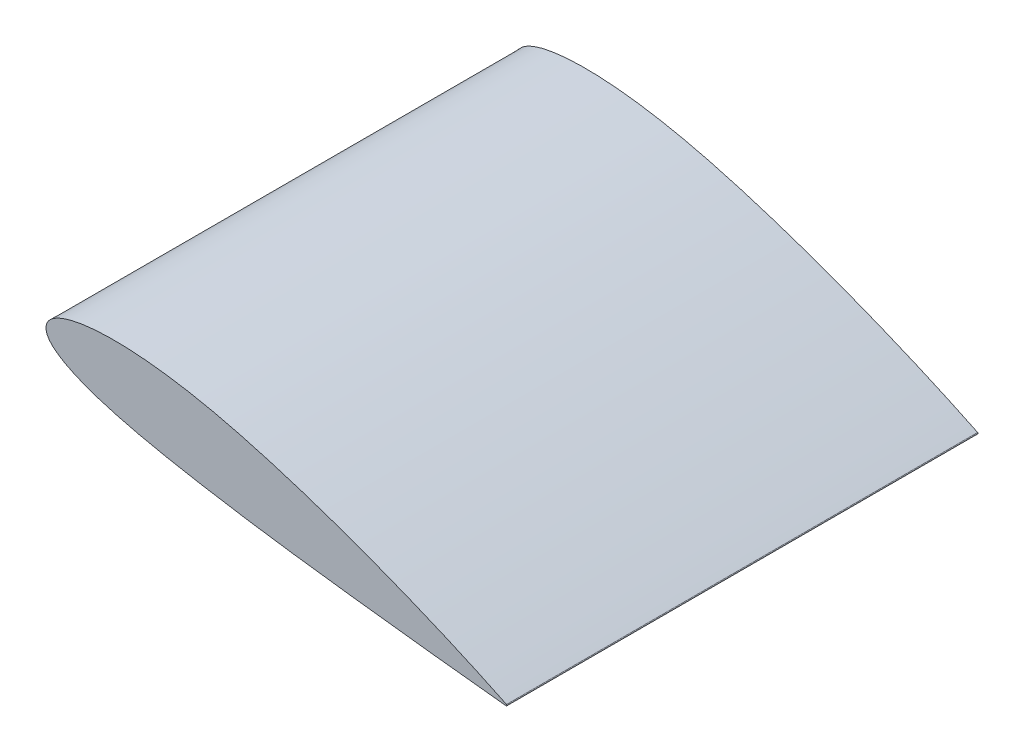
ISO-10303-21;
HEADER;
FILE_DESCRIPTION(('STEP AP214'),'2;1');
FILE_NAME('part.step','',(''),(''),'','','');
FILE_SCHEMA(('AUTOMOTIVE_DESIGN { 1 0 10303 214 1 1 1 1 }'));
ENDSEC;
DATA;
#1=APPLICATION_CONTEXT('core data for automotive mechanical design processes');
#2=APPLICATION_PROTOCOL_DEFINITION('international standard','automotive_design',2000,#1);
#3=PRODUCT_CONTEXT('',#1,'mechanical');
#4=PRODUCT('Part','Part','',(#3));
#5=PRODUCT_RELATED_PRODUCT_CATEGORY('part','',(#4));
#6=PRODUCT_DEFINITION_FORMATION('','',#4);
#7=PRODUCT_DEFINITION_CONTEXT('part definition',#1,'design');
#8=PRODUCT_DEFINITION('design','',#6,#7);
#9=PRODUCT_DEFINITION_SHAPE('','',#8);
#10=(LENGTH_UNIT() NAMED_UNIT(*) SI_UNIT(.MILLI.,.METRE.));
#11=(NAMED_UNIT(*) PLANE_ANGLE_UNIT() SI_UNIT($,.RADIAN.));
#12=(NAMED_UNIT(*) SI_UNIT($,.STERADIAN.) SOLID_ANGLE_UNIT());
#13=UNCERTAINTY_MEASURE_WITH_UNIT(LENGTH_MEASURE(1.E-05),#10,'distance_accuracy_value','');
#14=(GEOMETRIC_REPRESENTATION_CONTEXT(3) GLOBAL_UNCERTAINTY_ASSIGNED_CONTEXT((#13)) GLOBAL_UNIT_ASSIGNED_CONTEXT((#10,
#11,#12)) REPRESENTATION_CONTEXT('',''));
#15=CARTESIAN_POINT('',(0.,0.,0.));
#16=DIRECTION('',(0.,0.,1.));
#17=DIRECTION('',(1.,0.,0.));
#18=AXIS2_PLACEMENT_3D('',#15,#16,#17);
#19=CARTESIAN_POINT('',(93.0586603401604,-19.5766326634734,-127.));
#20=CARTESIAN_POINT('',(92.9570024031191,-19.526335478335,-127.));
#21=CARTESIAN_POINT('',(92.5395177145517,-19.3197770404548,-127.));
#22=CARTESIAN_POINT('',(91.5919136093808,-18.8713818292214,-127.));
#23=CARTESIAN_POINT('',(90.0209402387516,-18.1207589830441,-127.));
#24=CARTESIAN_POINT('',(87.8382147190076,-17.0988282549567,-127.));
#25=CARTESIAN_POINT('',(85.0665212592635,-15.8213172253829,-127.));
#26=CARTESIAN_POINT('',(81.7322626860257,-14.3132753020164,-127.));
#27=CARTESIAN_POINT('',(77.8644434983453,-12.6100497239082,-127.));
#28=CARTESIAN_POINT('',(73.5035744477143,-10.7365973458046,-127.));
#29=CARTESIAN_POINT('',(68.6904902191342,-8.7323656298943,-127.));
#30=CARTESIAN_POINT('',(63.474966761396,-6.62946967938085,-127.));
#31=CARTESIAN_POINT('',(57.9086169512114,-4.46705090747938,-127.));
#32=CARTESIAN_POINT('',(52.0496487733107,-2.28032752176042,-127.));
#33=CARTESIAN_POINT('',(45.958672309095,-0.10834160577163,-127.));
#34=CARTESIAN_POINT('',(39.6995239551761,2.01003839680255,-127.));
#35=CARTESIAN_POINT('',(33.3384873522213,4.03993976814188,-127.));
#36=CARTESIAN_POINT('',(26.9397888183334,5.93853109417681,-127.));
#37=CARTESIAN_POINT('',(20.5560978150045,7.68719028007833,-127.));
#38=CARTESIAN_POINT('',(14.2451613833883,9.21162080589179,-127.));
#39=CARTESIAN_POINT('',(8.07867690324422,10.4721033294232,-127.));
#40=CARTESIAN_POINT('',(2.14793293394034,11.4461848526644,-127.));
#41=CARTESIAN_POINT('',(-3.4745336281449,12.127374153549,-127.));
#42=CARTESIAN_POINT('',(-8.72210533152348,12.5095938303939,-127.));
#43=CARTESIAN_POINT('',(-13.5304552164742,12.6059595477218,-127.));
#44=CARTESIAN_POINT('',(-17.8422714057568,12.4246177821927,-127.));
#45=CARTESIAN_POINT('',(-21.6078266297221,11.9941367342961,-127.));
#46=CARTESIAN_POINT('',(-24.7852303610678,11.3307506011008,-127.));
#47=CARTESIAN_POINT('',(-27.3493844123884,10.464386920837,-127.));
#48=CARTESIAN_POINT('',(-29.2867459316771,9.40768277733117,-127.));
#49=CARTESIAN_POINT('',(-30.6036570328359,8.13744308132767,-127.));
#50=CARTESIAN_POINT('',(-31.1858503182274,6.6153553231,-127.));
#51=CARTESIAN_POINT('',(-30.948197504284,5.00672079909341,-127.));
#52=CARTESIAN_POINT('',(-29.9590692613712,3.47998568367411,-127.));
#53=CARTESIAN_POINT('',(-28.3368318401596,2.01650272638255,-127.));
#54=CARTESIAN_POINT('',(-26.0935344330945,0.578915896711411,-127.));
#55=CARTESIAN_POINT('',(-23.2442369635098,-0.830892785387249,-127.));
#56=CARTESIAN_POINT('',(-19.8146653741149,-2.20500809935629,-127.));
#57=CARTESIAN_POINT('',(-15.8395417475455,-3.53102753603345,-127.));
#58=CARTESIAN_POINT('',(-11.3617472657459,-4.80460998339912,-127.));
#59=CARTESIAN_POINT('',(-6.42884231192341,-6.02123131660751,-127.));
#60=CARTESIAN_POINT('',(-1.09269728776795,-7.18321857985703,-127.));
#61=CARTESIAN_POINT('',(4.59008040315868,-8.2943315095586,-127.));
#62=CARTESIAN_POINT('',(10.5591120777589,-9.36305454101999,-127.));
#63=CARTESIAN_POINT('',(16.7693349758511,-10.4077185848987,-127.));
#64=CARTESIAN_POINT('',(23.1572949137321,-11.4220478713945,-127.));
#65=CARTESIAN_POINT('',(29.6592891793678,-12.3729547218072,-127.));
#66=CARTESIAN_POINT('',(36.1807632889223,-13.2729401488393,-127.));
#67=CARTESIAN_POINT('',(42.6480424700331,-14.1225084538232,-127.));
#68=CARTESIAN_POINT('',(48.9879783827579,-14.9242016598455,-127.));
#69=CARTESIAN_POINT('',(55.1287966389954,-15.6824447140846,-127.));
#70=CARTESIAN_POINT('',(61.0027800848974,-16.3868254401119,-127.));
#71=CARTESIAN_POINT('',(66.5429263914039,-17.0405259184565,-127.));
#72=CARTESIAN_POINT('',(71.6874515144797,-17.6350916778184,-127.));
#73=CARTESIAN_POINT('',(76.3773960646738,-18.1680510062031,-127.));
#74=CARTESIAN_POINT('',(80.558605362021,-18.6365649013372,-127.));
#75=CARTESIAN_POINT('',(84.1837790104455,-19.0335585607668,-127.));
#76=CARTESIAN_POINT('',(87.2103196306277,-19.3591200896401,-127.));
#77=CARTESIAN_POINT('',(89.6028868613607,-19.6128649821528,-127.));
#78=CARTESIAN_POINT('',(91.3320797358895,-19.7955217201453,-127.));
#79=CARTESIAN_POINT('',(92.3826920634706,-19.9031209045822,-127.));
#80=CARTESIAN_POINT('',(92.8541068482899,-19.9532717518215,-127.));
#81=CARTESIAN_POINT('',(92.9758503003284,-19.9662232702342,-127.));
#82=B_SPLINE_CURVE_WITH_KNOTS('',3,(#19,#20,#21,#22,#23,#24,#25,#26,#27,#28,#29,#30,#31,#32,#33,
#34,#35,#36,#37,#38,#39,#40,#41,#42,#43,#44,#45,#46,#47,#48,#49,#50,#51,#52,#53,#54,#55,#56,#57,
#58,#59,#60,#61,#62,#63,#64,#65,#66,#67,#68,#69,#70,#71,#72,#73,#74,#75,#76,#77,#78,#79,#80,
#81),.UNSPECIFIED.,.F.,.F.,(4,1,1,1,1,1,1,1,1,1,1,1,1,1,1,1,1,1,1,1,1,1,1,1,1,1,1,1,1,1,1,1,1,1,
1,1,1,1,1,1,1,1,1,1,1,1,1,1,1,1,1,1,1,1,1,1,1,1,1,1,4),(0.,0.00130334450771463,
0.00535252230899537,0.0120463391317453,0.0213110944502395,0.0330476223945204,0.0471172151209096,
0.0633625080701345,0.0816121152043147,0.101657457251514,0.123273921483703,0.146232520323734,
0.170277757132092,0.195135791457301,0.220540260457298,0.246208390086661,0.271859817624248,
0.297233649675704,0.32226027454309,0.346452957899317,0.369543630541379,0.39130727551813,
0.411513240657824,0.429980366745659,0.446542667033163,0.461070388848797,0.473485741632755,
0.483779538851851,0.492063936444463,0.498681587764252,0.504376592822902,0.510069862803764,
0.516664638096755,0.524877655219018,0.535024568512073,0.547190470696629,0.561360064127826,
0.577448521055754,0.595323849545367,0.61484313654323,0.635823685513443,0.658074561029986,
0.681378870254446,0.705504985620235,0.730440423602308,0.755703478300476,0.78101527468104,
0.806090940754041,0.830659549821916,0.854449960993451,0.877193251088143,0.898643274073507,
0.918555547337279,0.936704445205411,0.952884105716394,0.966904110051011,0.978611737935814,
0.987863880462776,0.994552223257594,0.998593104909067,1.),.UNSPECIFIED.);
#83=DIRECTION('',(0.,0.,1.));
#84=VECTOR('',#83,1.);
#85=SURFACE_OF_LINEAR_EXTRUSION('',#82,#84);
#86=CARTESIAN_POINT('',(93.0586603401604,-19.5766326634734,0.));
#87=CARTESIAN_POINT('',(92.9570024031191,-19.526335478335,0.));
#88=CARTESIAN_POINT('',(92.5395177145517,-19.3197770404548,0.));
#89=CARTESIAN_POINT('',(91.5919136093808,-18.8713818292214,0.));
#90=CARTESIAN_POINT('',(90.0209402387516,-18.1207589830441,0.));
#91=CARTESIAN_POINT('',(87.8382147190076,-17.0988282549567,0.));
#92=CARTESIAN_POINT('',(85.0665212592635,-15.8213172253829,0.));
#93=CARTESIAN_POINT('',(81.7322626860257,-14.3132753020164,0.));
#94=CARTESIAN_POINT('',(77.8644434983453,-12.6100497239082,0.));
#95=CARTESIAN_POINT('',(73.5035744477143,-10.7365973458046,0.));
#96=CARTESIAN_POINT('',(68.6904902191342,-8.7323656298943,0.));
#97=CARTESIAN_POINT('',(63.474966761396,-6.62946967938085,0.));
#98=CARTESIAN_POINT('',(57.9086169512114,-4.46705090747938,0.));
#99=CARTESIAN_POINT('',(52.0496487733107,-2.28032752176042,0.));
#100=CARTESIAN_POINT('',(45.958672309095,-0.10834160577163,0.));
#101=CARTESIAN_POINT('',(39.6995239551761,2.01003839680255,0.));
#102=CARTESIAN_POINT('',(33.3384873522213,4.03993976814188,0.));
#103=CARTESIAN_POINT('',(26.9397888183334,5.93853109417681,0.));
#104=CARTESIAN_POINT('',(20.5560978150045,7.68719028007833,0.));
#105=CARTESIAN_POINT('',(14.2451613833883,9.21162080589179,0.));
#106=CARTESIAN_POINT('',(8.07867690324422,10.4721033294232,0.));
#107=CARTESIAN_POINT('',(2.14793293394034,11.4461848526644,0.));
#108=CARTESIAN_POINT('',(-3.4745336281449,12.127374153549,0.));
#109=CARTESIAN_POINT('',(-8.72210533152348,12.5095938303939,0.));
#110=CARTESIAN_POINT('',(-13.5304552164742,12.6059595477218,0.));
#111=CARTESIAN_POINT('',(-17.8422714057568,12.4246177821927,0.));
#112=CARTESIAN_POINT('',(-21.6078266297221,11.9941367342961,0.));
#113=CARTESIAN_POINT('',(-24.7852303610678,11.3307506011008,0.));
#114=CARTESIAN_POINT('',(-27.3493844123884,10.464386920837,0.));
#115=CARTESIAN_POINT('',(-29.2867459316771,9.40768277733117,0.));
#116=CARTESIAN_POINT('',(-30.6036570328359,8.13744308132767,0.));
#117=CARTESIAN_POINT('',(-31.1858503182274,6.6153553231,0.));
#118=CARTESIAN_POINT('',(-30.948197504284,5.00672079909341,0.));
#119=CARTESIAN_POINT('',(-29.9590692613712,3.47998568367411,0.));
#120=CARTESIAN_POINT('',(-28.3368318401596,2.01650272638255,0.));
#121=CARTESIAN_POINT('',(-26.0935344330945,0.578915896711411,0.));
#122=CARTESIAN_POINT('',(-23.2442369635098,-0.830892785387249,0.));
#123=CARTESIAN_POINT('',(-19.8146653741149,-2.20500809935629,0.));
#124=CARTESIAN_POINT('',(-15.8395417475455,-3.53102753603345,0.));
#125=CARTESIAN_POINT('',(-11.3617472657459,-4.80460998339912,0.));
#126=CARTESIAN_POINT('',(-6.42884231192341,-6.02123131660751,0.));
#127=CARTESIAN_POINT('',(-1.09269728776795,-7.18321857985703,0.));
#128=CARTESIAN_POINT('',(4.59008040315868,-8.2943315095586,0.));
#129=CARTESIAN_POINT('',(10.5591120777589,-9.36305454101999,0.));
#130=CARTESIAN_POINT('',(16.7693349758511,-10.4077185848987,0.));
#131=CARTESIAN_POINT('',(23.1572949137321,-11.4220478713945,0.));
#132=CARTESIAN_POINT('',(29.6592891793678,-12.3729547218072,0.));
#133=CARTESIAN_POINT('',(36.1807632889223,-13.2729401488393,0.));
#134=CARTESIAN_POINT('',(42.6480424700331,-14.1225084538232,0.));
#135=CARTESIAN_POINT('',(48.9879783827579,-14.9242016598455,0.));
#136=CARTESIAN_POINT('',(55.1287966389954,-15.6824447140846,0.));
#137=CARTESIAN_POINT('',(61.0027800848974,-16.3868254401119,0.));
#138=CARTESIAN_POINT('',(66.5429263914039,-17.0405259184565,0.));
#139=CARTESIAN_POINT('',(71.6874515144797,-17.6350916778184,0.));
#140=CARTESIAN_POINT('',(76.3773960646738,-18.1680510062031,0.));
#141=CARTESIAN_POINT('',(80.558605362021,-18.6365649013372,0.));
#142=CARTESIAN_POINT('',(84.1837790104455,-19.0335585607668,0.));
#143=CARTESIAN_POINT('',(87.2103196306277,-19.3591200896401,0.));
#144=CARTESIAN_POINT('',(89.6028868613607,-19.6128649821528,0.));
#145=CARTESIAN_POINT('',(91.3320797358895,-19.7955217201453,0.));
#146=CARTESIAN_POINT('',(92.3826920634706,-19.9031209045822,0.));
#147=CARTESIAN_POINT('',(92.8541068482899,-19.9532717518215,0.));
#148=CARTESIAN_POINT('',(92.9758503003284,-19.9662232702342,0.));
#149=B_SPLINE_CURVE_WITH_KNOTS('',3,(#86,#87,#88,#89,#90,#91,#92,#93,#94,#95,#96,#97,#98,#99,
#100,#101,#102,#103,#104,#105,#106,#107,#108,#109,#110,#111,#112,#113,#114,#115,#116,#117,#118,
#119,#120,#121,#122,#123,#124,#125,#126,#127,#128,#129,#130,#131,#132,#133,#134,#135,#136,#137,
#138,#139,#140,#141,#142,#143,#144,#145,#146,#147,#148),.UNSPECIFIED.,.F.,.F.,(4,1,1,1,1,1,1,1,
1,1,1,1,1,1,1,1,1,1,1,1,1,1,1,1,1,1,1,1,1,1,1,1,1,1,1,1,1,1,1,1,1,1,1,1,1,1,1,1,1,1,1,1,1,1,1,1,
1,1,1,1,4),(0.,0.00130334450771463,0.00535252230899537,0.0120463391317453,0.0213110944502395,
0.0330476223945204,0.0471172151209096,0.0633625080701345,0.0816121152043147,0.101657457251514,
0.123273921483703,0.146232520323734,0.170277757132092,0.195135791457301,0.220540260457298,
0.246208390086661,0.271859817624248,0.297233649675704,0.32226027454309,0.346452957899317,
0.369543630541379,0.39130727551813,0.411513240657824,0.429980366745659,0.446542667033163,
0.461070388848797,0.473485741632755,0.483779538851851,0.492063936444463,0.498681587764252,
0.504376592822902,0.510069862803764,0.516664638096755,0.524877655219018,0.535024568512073,
0.547190470696629,0.561360064127826,0.577448521055754,0.595323849545367,0.61484313654323,
0.635823685513443,0.658074561029986,0.681378870254446,0.705504985620235,0.730440423602308,
0.755703478300476,0.78101527468104,0.806090940754041,0.830659549821916,0.854449960993451,
0.877193251088143,0.898643274073507,0.918555547337279,0.936704445205411,0.952884105716394,
0.966904110051011,0.978611737935814,0.987863880462776,0.994552223257594,0.998593104909067,1.),.UNSPECIFIED.);
#150=CARTESIAN_POINT('',(93.0586603401604,-19.5766326634734,0.));
#151=VERTEX_POINT('',#150);
#152=CARTESIAN_POINT('',(92.9758503003284,-19.9662232702342,0.));
#153=VERTEX_POINT('',#152);
#154=EDGE_CURVE('E76',#151,#153,#149,.T.);
#155=ORIENTED_EDGE('',*,*,#154,.F.);
#156=DIRECTION('',(0.,0.,1.));
#157=VECTOR('',#156,1.);
#158=CARTESIAN_POINT('',(93.0586603401604,-19.5766326634734,-127.));
#159=LINE('',#158,#157);
#160=CARTESIAN_POINT('',(93.0586603401604,-19.5766326634734,-127.));
#161=VERTEX_POINT('',#160);
#162=EDGE_CURVE('E11',#161,#151,#159,.T.);
#163=ORIENTED_EDGE('',*,*,#162,.F.);
#164=CARTESIAN_POINT('',(92.9758503003284,-19.9662232702342,-127.));
#165=VERTEX_POINT('',#164);
#166=EDGE_CURVE('E78',#161,#165,#82,.T.);
#167=ORIENTED_EDGE('',*,*,#166,.T.);
#168=DIRECTION('',(0.,0.,1.));
#169=VECTOR('',#168,1.);
#170=CARTESIAN_POINT('',(92.9758503003284,-19.9662232702342,-127.));
#171=LINE('',#170,#169);
#172=EDGE_CURVE('E47',#165,#153,#171,.T.);
#173=ORIENTED_EDGE('',*,*,#172,.T.);
#174=EDGE_LOOP('',(#155,#163,#167,#173));
#175=FACE_BOUND('',#174,.T.);
#176=ADVANCED_FACE('F43',(#175),#85,.T.);
#177=CARTESIAN_POINT('',(92.9675129119937,-19.7608548915868,-127.));
#178=DIRECTION('',(0.,0.,1.));
#179=DIRECTION('',(1.,0.,0.));
#180=AXIS2_PLACEMENT_3D('',#177,#178,#179);
#181=CYLINDRICAL_SURFACE('',#180,0.205537546430022);
#182=CARTESIAN_POINT('',(92.9675129119937,-19.7608548915868,0.));
#183=DIRECTION('',(0.,0.,-1.));
#184=DIRECTION('',(-1.,0.,0.));
#185=AXIS2_PLACEMENT_3D('',#182,#183,#184);
#186=CIRCLE('',#185,0.205537546430022);
#187=EDGE_CURVE('E70',#151,#153,#186,.T.);
#188=ORIENTED_EDGE('',*,*,#187,.T.);
#189=ORIENTED_EDGE('',*,*,#172,.F.);
#190=CARTESIAN_POINT('',(92.9675129119937,-19.7608548915868,-127.));
#191=DIRECTION('',(0.,0.,-1.));
#192=DIRECTION('',(-1.,0.,0.));
#193=AXIS2_PLACEMENT_3D('',#190,#191,#192);
#194=CIRCLE('',#193,0.205537546430022);
#195=EDGE_CURVE('E72',#161,#165,#194,.T.);
#196=ORIENTED_EDGE('',*,*,#195,.F.);
#197=ORIENTED_EDGE('',*,*,#162,.T.);
#198=EDGE_LOOP('',(#188,#189,#196,#197));
#199=FACE_BOUND('',#198,.T.);
#200=ADVANCED_FACE('F69',(#199),#181,.T.);
#201=CARTESIAN_POINT('',(-30.7219832032565,7.69759717085577,-127.));
#202=DIRECTION('',(0.,0.,-1.));
#203=DIRECTION('',(-1.,0.,0.));
#204=AXIS2_PLACEMENT_3D('',#201,#202,#203);
#205=PLANE('',#204);
#206=ORIENTED_EDGE('',*,*,#166,.F.);
#207=ORIENTED_EDGE('',*,*,#195,.T.);
#208=EDGE_LOOP('',(#206,#207));
#209=FACE_BOUND('',#208,.T.);
#210=ADVANCED_FACE('F97',(#209),#205,.T.);
#211=CARTESIAN_POINT('',(-30.7219832032565,7.69759717085577,0.));
#212=DIRECTION('',(0.,0.,-1.));
#213=DIRECTION('',(-1.,0.,0.));
#214=AXIS2_PLACEMENT_3D('',#211,#212,#213);
#215=PLANE('',#214);
#216=ORIENTED_EDGE('',*,*,#154,.T.);
#217=ORIENTED_EDGE('',*,*,#187,.F.);
#218=EDGE_LOOP('',(#216,#217));
#219=FACE_BOUND('',#218,.T.);
#220=ADVANCED_FACE('F75',(#219),#215,.F.);
#221=CLOSED_SHELL('',(#176,#200,#210,#220));
#222=MANIFOLD_SOLID_BREP('B2',#221);
#223=ADVANCED_BREP_SHAPE_REPRESENTATION('',(#18,#222),#14);
#224=SHAPE_DEFINITION_REPRESENTATION(#9,#223);
ENDSEC;
END-ISO-10303-21;
